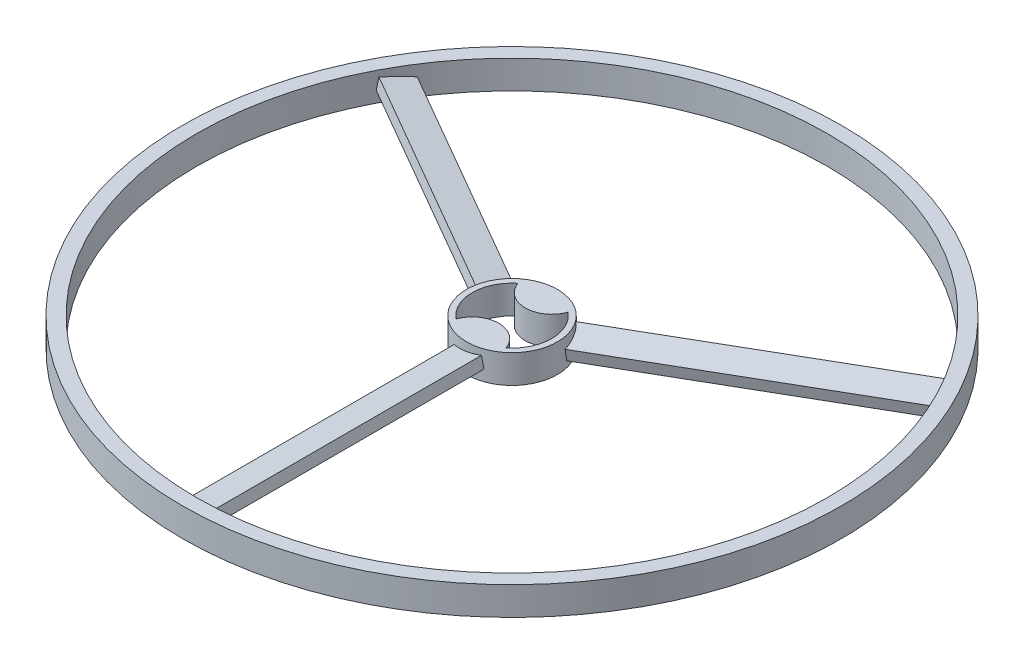
ISO-10303-21;
HEADER;
FILE_DESCRIPTION(('STEP AP214'),'2;1');
FILE_NAME('part.step','',(''),(''),'','','');
FILE_SCHEMA(('AUTOMOTIVE_DESIGN { 1 0 10303 214 1 1 1 1 }'));
ENDSEC;
DATA;
#1=APPLICATION_CONTEXT('core data for automotive mechanical design processes');
#2=APPLICATION_PROTOCOL_DEFINITION('international standard','automotive_design',2000,#1);
#3=PRODUCT_CONTEXT('',#1,'mechanical');
#4=PRODUCT('Part','Part','',(#3));
#5=PRODUCT_RELATED_PRODUCT_CATEGORY('part','',(#4));
#6=PRODUCT_DEFINITION_FORMATION('','',#4);
#7=PRODUCT_DEFINITION_CONTEXT('part definition',#1,'design');
#8=PRODUCT_DEFINITION('design','',#6,#7);
#9=PRODUCT_DEFINITION_SHAPE('','',#8);
#10=(LENGTH_UNIT() NAMED_UNIT(*) SI_UNIT(.MILLI.,.METRE.));
#11=(NAMED_UNIT(*) PLANE_ANGLE_UNIT() SI_UNIT($,.RADIAN.));
#12=(NAMED_UNIT(*) SI_UNIT($,.STERADIAN.) SOLID_ANGLE_UNIT());
#13=UNCERTAINTY_MEASURE_WITH_UNIT(LENGTH_MEASURE(1.E-05),#10,'distance_accuracy_value','');
#14=(GEOMETRIC_REPRESENTATION_CONTEXT(3) GLOBAL_UNCERTAINTY_ASSIGNED_CONTEXT((#13)) GLOBAL_UNIT_ASSIGNED_CONTEXT((#10,
#11,#12)) REPRESENTATION_CONTEXT('',''));
#15=CARTESIAN_POINT('',(0.,0.,0.));
#16=DIRECTION('',(0.,0.,1.));
#17=DIRECTION('',(1.,0.,0.));
#18=AXIS2_PLACEMENT_3D('',#15,#16,#17);
#19=CARTESIAN_POINT('',(0.,2.5,0.));
#20=DIRECTION('',(0.,-1.,0.));
#21=DIRECTION('',(0.,0.,-1.));
#22=AXIS2_PLACEMENT_3D('',#19,#20,#21);
#23=CYLINDRICAL_SURFACE('',#22,55.5);
#24=CARTESIAN_POINT('',(0.,2.5,0.));
#25=DIRECTION('',(0.,1.,0.));
#26=DIRECTION('',(0.,0.,1.));
#27=AXIS2_PLACEMENT_3D('',#24,#25,#26);
#28=CIRCLE('',#27,55.5);
#29=CARTESIAN_POINT('',(0.,2.5,55.5));
#30=VERTEX_POINT('',#29);
#31=EDGE_CURVE('E270',#30,#30,#28,.T.);
#32=ORIENTED_EDGE('',*,*,#31,.T.);
#33=EDGE_LOOP('',(#32));
#34=FACE_BOUND('',#33,.T.);
#35=CARTESIAN_POINT('',(0.,-2.5,0.));
#36=DIRECTION('',(0.,1.,0.));
#37=DIRECTION('',(0.,0.,1.));
#38=AXIS2_PLACEMENT_3D('',#35,#36,#37);
#39=CIRCLE('',#38,55.5);
#40=CARTESIAN_POINT('',(0.,-2.5,55.5));
#41=VERTEX_POINT('',#40);
#42=EDGE_CURVE('E269',#41,#41,#39,.T.);
#43=ORIENTED_EDGE('',*,*,#42,.F.);
#44=EDGE_LOOP('',(#43));
#45=FACE_BOUND('',#44,.T.);
#46=CARTESIAN_POINT('',(0.,-1.01542661188575,0.));
#47=DIRECTION('',(-0.173648177666931,0.984807753012208,0.));
#48=DIRECTION('',(-0.984807753012208,-0.173648177666931,0.));
#49=AXIS2_PLACEMENT_3D('',#46,#47,#48);
#50=ELLIPSE('',#49,56.3561769596588,55.5);
#51=CARTESIAN_POINT('',(2.63566756019745,-0.55068730884488,55.437381400208));
#52=VERTEX_POINT('',#51);
#53=CARTESIAN_POINT('',(-2.28837120486359,-1.41892819717954,55.452802969992));
#54=VERTEX_POINT('',#53);
#55=EDGE_CURVE('E266',#52,#54,#50,.F.);
#56=ORIENTED_EDGE('',*,*,#55,.F.);
#57=CARTESIAN_POINT('',(0.,14.396926207859,0.));
#58=DIRECTION('',(-0.984807753012208,-0.173648177666932,0.));
#59=DIRECTION('',(0.173648177666932,-0.984807753012208,0.));
#60=AXIS2_PLACEMENT_3D('',#57,#58,#59);
#61=ELLIPSE('',#60,319.611761814469,55.5);
#62=CARTESIAN_POINT('',(2.28837120486359,1.41892819717954,55.452802969992));
#63=VERTEX_POINT('',#62);
#64=EDGE_CURVE('E264',#63,#52,#61,.F.);
#65=ORIENTED_EDGE('',*,*,#64,.F.);
#66=CARTESIAN_POINT('',(0.,1.01542661188575,0.));
#67=DIRECTION('',(0.173648177666931,-0.984807753012208,0.));
#68=DIRECTION('',(-0.984807753012208,-0.173648177666932,0.));
#69=AXIS2_PLACEMENT_3D('',#66,#67,#68);
#70=ELLIPSE('',#69,56.3561769596589,55.5);
#71=CARTESIAN_POINT('',(-2.63566756019745,0.550687308844879,55.437381400208));
#72=VERTEX_POINT('',#71);
#73=EDGE_CURVE('E262',#72,#63,#70,.F.);
#74=ORIENTED_EDGE('',*,*,#73,.F.);
#75=CARTESIAN_POINT('',(0.,-14.396926207859,0.));
#76=DIRECTION('',(0.984807753012208,0.173648177666931,0.));
#77=DIRECTION('',(0.173648177666931,-0.984807753012208,0.));
#78=AXIS2_PLACEMENT_3D('',#75,#76,#77);
#79=ELLIPSE('',#78,319.61176181447,55.5);
#80=EDGE_CURVE('E258',#54,#72,#79,.F.);
#81=ORIENTED_EDGE('',*,*,#80,.F.);
#82=EDGE_LOOP('',(#56,#65,#74,#81));
#83=FACE_BOUND('',#82,.T.);
#84=CARTESIAN_POINT('',(0.,14.396926207859,0.));
#85=DIRECTION('',(0.492403876506108,-0.173648177666932,-0.852868531952441));
#86=DIRECTION('',(-0.0868240888334665,-0.984807753012208,0.150383733180436));
#87=AXIS2_PLACEMENT_3D('',#84,#85,#86);
#88=ELLIPSE('',#87,319.611761814469,55.5);
#89=CARTESIAN_POINT('',(-49.1677216854979,1.41892819717954,-25.7446138882956));
#90=VERTEX_POINT('',#89);
#91=CARTESIAN_POINT('',(-49.3280143919657,-0.55068730884488,-25.4361356370427));
#92=VERTEX_POINT('',#91);
#93=EDGE_CURVE('E226',#90,#92,#88,.F.);
#94=ORIENTED_EDGE('',*,*,#93,.F.);
#95=CARTESIAN_POINT('',(0.,1.01542661188575,0.));
#96=DIRECTION('',(-0.0868240888334665,-0.984807753012208,0.150383733180436));
#97=DIRECTION('',(0.492403876506108,-0.173648177666932,-0.852868531952441));
#98=AXIS2_PLACEMENT_3D('',#95,#96,#97);
#99=ELLIPSE('',#98,56.3561769596589,55.5);
#100=CARTESIAN_POINT('',(-46.6923468317682,0.550687308844879,-30.0012457631658));
#101=VERTEX_POINT('',#100);
#102=EDGE_CURVE('E231',#101,#90,#99,.F.);
#103=ORIENTED_EDGE('',*,*,#102,.F.);
#104=CARTESIAN_POINT('',(0.,-14.396926207859,0.));
#105=DIRECTION('',(-0.492403876506108,0.173648177666931,0.852868531952441));
#106=DIRECTION('',(-0.0868240888334665,-0.984807753012208,0.150383733180436));
#107=AXIS2_PLACEMENT_3D('',#104,#105,#106);
#108=ELLIPSE('',#107,319.61176181447,55.5);
#109=CARTESIAN_POINT('',(-46.8793504806343,-1.41892819717954,-29.7081890816969));
#110=VERTEX_POINT('',#109);
#111=EDGE_CURVE('E206',#110,#101,#108,.F.);
#112=ORIENTED_EDGE('',*,*,#111,.F.);
#113=CARTESIAN_POINT('',(0.,-1.01542661188575,0.));
#114=DIRECTION('',(0.0868240888334664,0.984807753012208,-0.150383733180436));
#115=DIRECTION('',(0.492403876506108,-0.173648177666931,-0.852868531952441));
#116=AXIS2_PLACEMENT_3D('',#113,#114,#115);
#117=ELLIPSE('',#116,56.3561769596588,55.5);
#118=EDGE_CURVE('E219',#92,#110,#117,.F.);
#119=ORIENTED_EDGE('',*,*,#118,.F.);
#120=EDGE_LOOP('',(#94,#103,#112,#119));
#121=FACE_BOUND('',#120,.T.);
#122=CARTESIAN_POINT('',(0.,14.396926207859,0.));
#123=DIRECTION('',(0.492403876506096,-0.173648177666932,0.852868531952447));
#124=DIRECTION('',(-0.0868240888334644,-0.984807753012208,-0.150383733180437));
#125=AXIS2_PLACEMENT_3D('',#122,#123,#124);
#126=ELLIPSE('',#125,319.611761814469,55.5);
#127=CARTESIAN_POINT('',(46.8793504806347,1.41892819717954,-29.7081890816962));
#128=VERTEX_POINT('',#127);
#129=CARTESIAN_POINT('',(46.6923468317686,-0.55068730884488,-30.0012457631651));
#130=VERTEX_POINT('',#129);
#131=EDGE_CURVE('E196',#128,#130,#126,.F.);
#132=ORIENTED_EDGE('',*,*,#131,.F.);
#133=CARTESIAN_POINT('',(0.,1.01542661188575,0.));
#134=DIRECTION('',(-0.0868240888334643,-0.984807753012208,-0.150383733180437));
#135=DIRECTION('',(0.492403876506096,-0.173648177666932,0.852868531952448));
#136=AXIS2_PLACEMENT_3D('',#133,#134,#135);
#137=ELLIPSE('',#136,56.3561769596589,55.5);
#138=CARTESIAN_POINT('',(49.328014391966,0.550687308844879,-25.436135637042));
#139=VERTEX_POINT('',#138);
#140=EDGE_CURVE('E201',#139,#128,#137,.F.);
#141=ORIENTED_EDGE('',*,*,#140,.F.);
#142=CARTESIAN_POINT('',(0.,-14.396926207859,0.));
#143=DIRECTION('',(-0.492403876506096,0.173648177666931,-0.852868531952447));
#144=DIRECTION('',(-0.0868240888334643,-0.984807753012208,-0.150383733180437));
#145=AXIS2_PLACEMENT_3D('',#142,#143,#144);
#146=ELLIPSE('',#145,319.61176181447,55.5);
#147=CARTESIAN_POINT('',(49.1677216854983,-1.41892819717954,-25.7446138882949));
#148=VERTEX_POINT('',#147);
#149=EDGE_CURVE('E176',#148,#139,#146,.F.);
#150=ORIENTED_EDGE('',*,*,#149,.F.);
#151=CARTESIAN_POINT('',(0.,-1.01542661188575,0.));
#152=DIRECTION('',(0.0868240888334643,0.984807753012208,0.150383733180437));
#153=DIRECTION('',(0.492403876506096,-0.173648177666931,0.852868531952448));
#154=AXIS2_PLACEMENT_3D('',#151,#152,#153);
#155=ELLIPSE('',#154,56.3561769596588,55.5);
#156=EDGE_CURVE('E189',#130,#148,#155,.F.);
#157=ORIENTED_EDGE('',*,*,#156,.F.);
#158=EDGE_LOOP('',(#132,#141,#150,#157));
#159=FACE_BOUND('',#158,.T.);
#160=ADVANCED_FACE('F34',(#34,#45,#83,#121,#159),#23,.F.);
#161=CARTESIAN_POINT('',(0.,2.5,0.));
#162=DIRECTION('',(0.,-1.,0.));
#163=DIRECTION('',(0.,0.,-1.));
#164=AXIS2_PLACEMENT_3D('',#161,#162,#163);
#165=CYLINDRICAL_SURFACE('',#164,8.);
#166=CARTESIAN_POINT('',(0.,1.01542661188575,0.));
#167=DIRECTION('',(-0.0868240888334665,-0.984807753012208,0.150383733180436));
#168=DIRECTION('',(0.492403876506108,-0.173648177666932,-0.852868531952441));
#169=AXIS2_PLACEMENT_3D('',#166,#167,#168);
#170=ELLIPSE('',#169,8.12341289508596,8.);
#171=CARTESIAN_POINT('',(-5.22356839253152,0.550687308844864,-6.05923536830726));
#172=VERTEX_POINT('',#171);
#173=CARTESIAN_POINT('',(-7.7828991767294,1.41892819717953,-1.85107547249291));
#174=VERTEX_POINT('',#173);
#175=EDGE_CURVE('E229',#172,#174,#170,.F.);
#176=ORIENTED_EDGE('',*,*,#175,.T.);
#177=CARTESIAN_POINT('',(0.,14.396926207859,0.));
#178=DIRECTION('',(0.492403876506108,-0.173648177666932,-0.852868531952441));
#179=DIRECTION('',(-0.0868240888334665,-0.984807753012208,0.150383733180436));
#180=AXIS2_PLACEMENT_3D('',#177,#178,#179);
#181=ELLIPSE('',#180,46.0701638651487,8.);
#182=CARTESIAN_POINT('',(-7.859235952729,-0.550687308844881,-1.49412524218419));
#183=VERTEX_POINT('',#182);
#184=EDGE_CURVE('E221',#174,#183,#181,.F.);
#185=ORIENTED_EDGE('',*,*,#184,.T.);
#186=CARTESIAN_POINT('',(0.,-1.01542661188575,0.));
#187=DIRECTION('',(0.0868240888334664,0.984807753012208,-0.150383733180436));
#188=DIRECTION('',(0.492403876506108,-0.173648177666931,-0.852868531952441));
#189=AXIS2_PLACEMENT_3D('',#186,#187,#188);
#190=ELLIPSE('',#189,8.12341289508596,8.);
#191=CARTESIAN_POINT('',(-5.4945279718658,-1.41892819717954,-5.81465066589425));
#192=VERTEX_POINT('',#191);
#193=EDGE_CURVE('E214',#183,#192,#190,.F.);
#194=ORIENTED_EDGE('',*,*,#193,.T.);
#195=CARTESIAN_POINT('',(0.,-14.396926207859,0.));
#196=DIRECTION('',(-0.492403876506108,0.173648177666931,0.852868531952441));
#197=DIRECTION('',(-0.0868240888334665,-0.984807753012208,0.150383733180436));
#198=AXIS2_PLACEMENT_3D('',#195,#196,#197);
#199=ELLIPSE('',#198,46.0701638651488,8.);
#200=EDGE_CURVE('E204',#192,#172,#199,.F.);
#201=ORIENTED_EDGE('',*,*,#200,.T.);
#202=EDGE_LOOP('',(#176,#185,#194,#201));
#203=FACE_BOUND('',#202,.T.);
#204=CARTESIAN_POINT('',(0.,2.5,0.));
#205=DIRECTION('',(0.,1.,0.));
#206=DIRECTION('',(0.,0.,1.));
#207=AXIS2_PLACEMENT_3D('',#204,#205,#206);
#208=CIRCLE('',#207,8.);
#209=CARTESIAN_POINT('',(0.,2.5,8.));
#210=VERTEX_POINT('',#209);
#211=EDGE_CURVE('E235',#210,#210,#208,.T.);
#212=ORIENTED_EDGE('',*,*,#211,.F.);
#213=EDGE_LOOP('',(#212));
#214=FACE_BOUND('',#213,.T.);
#215=CARTESIAN_POINT('',(0.,-2.5,0.));
#216=DIRECTION('',(0.,1.,0.));
#217=DIRECTION('',(0.,0.,1.));
#218=AXIS2_PLACEMENT_3D('',#215,#216,#217);
#219=CIRCLE('',#218,8.);
#220=CARTESIAN_POINT('',(0.,-2.5,8.));
#221=VERTEX_POINT('',#220);
#222=EDGE_CURVE('E234',#221,#221,#219,.T.);
#223=ORIENTED_EDGE('',*,*,#222,.T.);
#224=EDGE_LOOP('',(#223));
#225=FACE_BOUND('',#224,.T.);
#226=CARTESIAN_POINT('',(0.,1.01542661188575,0.));
#227=DIRECTION('',(0.173648177666931,-0.984807753012208,0.));
#228=DIRECTION('',(-0.984807753012208,-0.173648177666932,0.));
#229=AXIS2_PLACEMENT_3D('',#226,#227,#228);
#230=ELLIPSE('',#229,8.12341289508596,8.);
#231=CARTESIAN_POINT('',(-2.63566756019745,0.550687308844879,7.5533606104914));
#232=VERTEX_POINT('',#231);
#233=CARTESIAN_POINT('',(2.28837120486359,1.41892819717954,7.66572613838711));
#234=VERTEX_POINT('',#233);
#235=EDGE_CURVE('E243',#232,#234,#230,.F.);
#236=ORIENTED_EDGE('',*,*,#235,.T.);
#237=CARTESIAN_POINT('',(0.,14.396926207859,0.));
#238=DIRECTION('',(-0.984807753012208,-0.173648177666932,0.));
#239=DIRECTION('',(0.173648177666932,-0.984807753012208,0.));
#240=AXIS2_PLACEMENT_3D('',#237,#238,#239);
#241=ELLIPSE('',#240,46.0701638651487,8.);
#242=CARTESIAN_POINT('',(2.63566756019745,-0.55068730884488,7.5533606104914));
#243=VERTEX_POINT('',#242);
#244=EDGE_CURVE('E246',#234,#243,#241,.F.);
#245=ORIENTED_EDGE('',*,*,#244,.T.);
#246=CARTESIAN_POINT('',(0.,-1.01542661188575,0.));
#247=DIRECTION('',(-0.173648177666931,0.984807753012208,0.));
#248=DIRECTION('',(-0.984807753012208,-0.173648177666931,0.));
#249=AXIS2_PLACEMENT_3D('',#246,#247,#248);
#250=ELLIPSE('',#249,8.12341289508596,8.);
#251=CARTESIAN_POINT('',(-2.28837120486359,-1.41892819717954,7.66572613838711));
#252=VERTEX_POINT('',#251);
#253=EDGE_CURVE('E238',#243,#252,#250,.F.);
#254=ORIENTED_EDGE('',*,*,#253,.T.);
#255=CARTESIAN_POINT('',(0.,-14.396926207859,0.));
#256=DIRECTION('',(0.984807753012208,0.173648177666931,0.));
#257=DIRECTION('',(0.173648177666931,-0.984807753012208,0.));
#258=AXIS2_PLACEMENT_3D('',#255,#256,#257);
#259=ELLIPSE('',#258,46.0701638651488,8.);
#260=EDGE_CURVE('E279',#252,#232,#259,.F.);
#261=ORIENTED_EDGE('',*,*,#260,.T.);
#262=EDGE_LOOP('',(#236,#245,#254,#261));
#263=FACE_BOUND('',#262,.T.);
#264=CARTESIAN_POINT('',(0.,1.01542661188575,0.));
#265=DIRECTION('',(-0.0868240888334643,-0.984807753012208,-0.150383733180437));
#266=DIRECTION('',(0.492403876506096,-0.173648177666932,0.852868531952448));
#267=AXIS2_PLACEMENT_3D('',#264,#265,#266);
#268=ELLIPSE('',#267,8.12341289508596,8.);
#269=CARTESIAN_POINT('',(7.85923595272902,0.550687308844904,-1.49412524218407));
#270=VERTEX_POINT('',#269);
#271=CARTESIAN_POINT('',(5.49452797186587,1.41892819717954,-5.81465066589417));
#272=VERTEX_POINT('',#271);
#273=EDGE_CURVE('E199',#270,#272,#268,.F.);
#274=ORIENTED_EDGE('',*,*,#273,.T.);
#275=CARTESIAN_POINT('',(0.,14.396926207859,0.));
#276=DIRECTION('',(0.492403876506096,-0.173648177666932,0.852868531952447));
#277=DIRECTION('',(-0.0868240888334644,-0.984807753012208,-0.150383733180437));
#278=AXIS2_PLACEMENT_3D('',#275,#276,#277);
#279=ELLIPSE('',#278,46.0701638651487,8.);
#280=CARTESIAN_POINT('',(5.22356839253161,-0.550687308844881,-6.05923536830719));
#281=VERTEX_POINT('',#280);
#282=EDGE_CURVE('E191',#272,#281,#279,.F.);
#283=ORIENTED_EDGE('',*,*,#282,.T.);
#284=CARTESIAN_POINT('',(0.,-1.01542661188575,0.));
#285=DIRECTION('',(0.0868240888334643,0.984807753012208,0.150383733180437));
#286=DIRECTION('',(0.492403876506096,-0.173648177666931,0.852868531952448));
#287=AXIS2_PLACEMENT_3D('',#284,#285,#286);
#288=ELLIPSE('',#287,8.12341289508596,8.);
#289=CARTESIAN_POINT('',(7.78289917672944,-1.41892819717954,-1.85107547249281));
#290=VERTEX_POINT('',#289);
#291=EDGE_CURVE('E184',#281,#290,#288,.F.);
#292=ORIENTED_EDGE('',*,*,#291,.T.);
#293=CARTESIAN_POINT('',(0.,-14.396926207859,0.));
#294=DIRECTION('',(-0.492403876506096,0.173648177666931,-0.852868531952447));
#295=DIRECTION('',(-0.0868240888334643,-0.984807753012208,-0.150383733180437));
#296=AXIS2_PLACEMENT_3D('',#293,#294,#295);
#297=ELLIPSE('',#296,46.0701638651488,8.);
#298=EDGE_CURVE('E172',#290,#270,#297,.F.);
#299=ORIENTED_EDGE('',*,*,#298,.T.);
#300=EDGE_LOOP('',(#274,#283,#292,#299));
#301=FACE_BOUND('',#300,.T.);
#302=ADVANCED_FACE('F308',(#203,#214,#225,#263,#301),#165,.T.);
#303=CARTESIAN_POINT('',(0.,2.5,0.));
#304=DIRECTION('',(0.,1.,0.));
#305=DIRECTION('',(0.,0.,1.));
#306=AXIS2_PLACEMENT_3D('',#303,#304,#305);
#307=PLANE('',#306);
#308=CARTESIAN_POINT('',(0.,2.5,0.));
#309=DIRECTION('',(0.,1.,0.));
#310=DIRECTION('',(0.,0.,1.));
#311=AXIS2_PLACEMENT_3D('',#308,#309,#310);
#312=CIRCLE('',#311,58.);
#313=CARTESIAN_POINT('',(0.,2.5,58.));
#314=VERTEX_POINT('',#313);
#315=EDGE_CURVE('E276',#314,#314,#312,.T.);
#316=ORIENTED_EDGE('',*,*,#315,.T.);
#317=EDGE_LOOP('',(#316));
#318=FACE_BOUND('',#317,.T.);
#319=ORIENTED_EDGE('',*,*,#31,.F.);
#320=EDGE_LOOP('',(#319));
#321=FACE_BOUND('',#320,.T.);
#322=ADVANCED_FACE('F314',(#318,#321),#307,.T.);
#323=CARTESIAN_POINT('',(0.,-2.5,0.));
#324=DIRECTION('',(0.,1.,0.));
#325=DIRECTION('',(0.,0.,1.));
#326=AXIS2_PLACEMENT_3D('',#323,#324,#325);
#327=PLANE('',#326);
#328=CARTESIAN_POINT('',(0.,-2.5,0.));
#329=DIRECTION('',(0.,1.,0.));
#330=DIRECTION('',(0.,0.,1.));
#331=AXIS2_PLACEMENT_3D('',#328,#329,#330);
#332=CIRCLE('',#331,58.);
#333=CARTESIAN_POINT('',(0.,-2.5,58.));
#334=VERTEX_POINT('',#333);
#335=EDGE_CURVE('E273',#334,#334,#332,.T.);
#336=ORIENTED_EDGE('',*,*,#335,.F.);
#337=EDGE_LOOP('',(#336));
#338=FACE_BOUND('',#337,.T.);
#339=ORIENTED_EDGE('',*,*,#42,.T.);
#340=EDGE_LOOP('',(#339));
#341=FACE_BOUND('',#340,.T.);
#342=ADVANCED_FACE('F323',(#338,#341),#327,.F.);
#343=CARTESIAN_POINT('',(0.,2.5,0.));
#344=DIRECTION('',(0.,-1.,0.));
#345=DIRECTION('',(0.,0.,-1.));
#346=AXIS2_PLACEMENT_3D('',#343,#344,#345);
#347=CYLINDRICAL_SURFACE('',#346,58.);
#348=ORIENTED_EDGE('',*,*,#315,.F.);
#349=EDGE_LOOP('',(#348));
#350=FACE_BOUND('',#349,.T.);
#351=ORIENTED_EDGE('',*,*,#335,.T.);
#352=EDGE_LOOP('',(#351));
#353=FACE_BOUND('',#352,.T.);
#354=ADVANCED_FACE('F36',(#350,#353),#347,.T.);
#355=CARTESIAN_POINT('',(2.28837120486359,1.41892819717954,58.002));
#356=DIRECTION('',(-0.984807753012208,-0.173648177666932,0.));
#357=DIRECTION('',(0.173648177666932,-0.984807753012208,0.));
#358=AXIS2_PLACEMENT_3D('',#355,#356,#357);
#359=PLANE('',#358);
#360=ORIENTED_EDGE('',*,*,#244,.F.);
#361=DIRECTION('',(0.,0.,-1.));
#362=VECTOR('',#361,1.);
#363=CARTESIAN_POINT('',(2.28837120486359,1.41892819717954,58.002));
#364=LINE('',#363,#362);
#365=EDGE_CURVE('E254',#63,#234,#364,.T.);
#366=ORIENTED_EDGE('',*,*,#365,.F.);
#367=ORIENTED_EDGE('',*,*,#64,.T.);
#368=DIRECTION('',(0.,0.,-1.));
#369=VECTOR('',#368,1.);
#370=CARTESIAN_POINT('',(2.63566756019745,-0.55068730884488,58.002));
#371=LINE('',#370,#369);
#372=EDGE_CURVE('E255',#52,#243,#371,.T.);
#373=ORIENTED_EDGE('',*,*,#372,.T.);
#374=EDGE_LOOP('',(#360,#366,#367,#373));
#375=FACE_BOUND('',#374,.T.);
#376=ADVANCED_FACE('F330',(#375),#359,.F.);
#377=CARTESIAN_POINT('',(-2.63566756019745,0.550687308844879,58.002));
#378=DIRECTION('',(0.173648177666931,-0.984807753012208,0.));
#379=DIRECTION('',(0.984807753012208,0.173648177666932,0.));
#380=AXIS2_PLACEMENT_3D('',#377,#378,#379);
#381=PLANE('',#380);
#382=ORIENTED_EDGE('',*,*,#235,.F.);
#383=DIRECTION('',(0.,0.,-1.));
#384=VECTOR('',#383,1.);
#385=CARTESIAN_POINT('',(-2.63566756019745,0.550687308844879,58.002));
#386=LINE('',#385,#384);
#387=EDGE_CURVE('E252',#72,#232,#386,.T.);
#388=ORIENTED_EDGE('',*,*,#387,.F.);
#389=ORIENTED_EDGE('',*,*,#73,.T.);
#390=ORIENTED_EDGE('',*,*,#365,.T.);
#391=EDGE_LOOP('',(#382,#388,#389,#390));
#392=FACE_BOUND('',#391,.T.);
#393=ADVANCED_FACE('F392',(#392),#381,.F.);
#394=CARTESIAN_POINT('',(2.63566756019745,-0.55068730884488,58.002));
#395=DIRECTION('',(-0.173648177666931,0.984807753012208,0.));
#396=DIRECTION('',(-0.984807753012208,-0.173648177666931,0.));
#397=AXIS2_PLACEMENT_3D('',#394,#395,#396);
#398=PLANE('',#397);
#399=ORIENTED_EDGE('',*,*,#253,.F.);
#400=ORIENTED_EDGE('',*,*,#372,.F.);
#401=ORIENTED_EDGE('',*,*,#55,.T.);
#402=DIRECTION('',(0.,0.,-1.));
#403=VECTOR('',#402,1.);
#404=CARTESIAN_POINT('',(-2.28837120486359,-1.41892819717954,58.002));
#405=LINE('',#404,#403);
#406=EDGE_CURVE('E249',#54,#252,#405,.T.);
#407=ORIENTED_EDGE('',*,*,#406,.T.);
#408=EDGE_LOOP('',(#399,#400,#401,#407));
#409=FACE_BOUND('',#408,.T.);
#410=ADVANCED_FACE('F320',(#409),#398,.F.);
#411=CARTESIAN_POINT('',(-2.28837120486359,-1.41892819717954,58.002));
#412=DIRECTION('',(0.984807753012208,0.173648177666931,0.));
#413=DIRECTION('',(-0.173648177666931,0.984807753012208,0.));
#414=AXIS2_PLACEMENT_3D('',#411,#412,#413);
#415=PLANE('',#414);
#416=ORIENTED_EDGE('',*,*,#260,.F.);
#417=ORIENTED_EDGE('',*,*,#406,.F.);
#418=ORIENTED_EDGE('',*,*,#80,.T.);
#419=ORIENTED_EDGE('',*,*,#387,.T.);
#420=EDGE_LOOP('',(#416,#417,#418,#419));
#421=FACE_BOUND('',#420,.T.);
#422=ADVANCED_FACE('F332',(#421),#415,.F.);
#423=CARTESIAN_POINT('',(0.,2.5,0.));
#424=DIRECTION('',(0.,1.,0.));
#425=DIRECTION('',(0.,0.,1.));
#426=AXIS2_PLACEMENT_3D('',#423,#424,#425);
#427=PLANE('',#426);
#428=CARTESIAN_POINT('',(0.,2.5,7.));
#429=DIRECTION('',(0.,1.,0.));
#430=DIRECTION('',(0.,0.,1.));
#431=AXIS2_PLACEMENT_3D('',#428,#429,#430);
#432=CIRCLE('',#431,4.6667);
#433=CARTESIAN_POINT('',(-4.39980302593617,2.5,5.44442222214286));
#434=VERTEX_POINT('',#433);
#435=CARTESIAN_POINT('',(4.39980302593616,2.5,5.44442222214286));
#436=VERTEX_POINT('',#435);
#437=EDGE_CURVE('E158',#434,#436,#432,.F.);
#438=ORIENTED_EDGE('',*,*,#437,.F.);
#439=CARTESIAN_POINT('',(0.,2.5,0.));
#440=DIRECTION('',(0.,1.,0.));
#441=DIRECTION('',(0.,0.,1.));
#442=AXIS2_PLACEMENT_3D('',#439,#440,#441);
#443=CIRCLE('',#442,7.);
#444=CARTESIAN_POINT('',(-4.39980302593617,2.5,-5.44442222214286));
#445=VERTEX_POINT('',#444);
#446=EDGE_CURVE('E49',#434,#445,#443,.F.);
#447=ORIENTED_EDGE('',*,*,#446,.T.);
#448=CARTESIAN_POINT('',(0.,2.5,-7.));
#449=DIRECTION('',(0.,1.,0.));
#450=DIRECTION('',(0.,0.,1.));
#451=AXIS2_PLACEMENT_3D('',#448,#449,#450);
#452=CIRCLE('',#451,4.6667);
#453=CARTESIAN_POINT('',(4.39980302593616,2.5,-5.44442222214286));
#454=VERTEX_POINT('',#453);
#455=EDGE_CURVE('E165',#445,#454,#452,.T.);
#456=ORIENTED_EDGE('',*,*,#455,.T.);
#457=CARTESIAN_POINT('',(0.,2.5,0.));
#458=DIRECTION('',(0.,1.,0.));
#459=DIRECTION('',(0.,0.,1.));
#460=AXIS2_PLACEMENT_3D('',#457,#458,#459);
#461=CIRCLE('',#460,7.);
#462=EDGE_CURVE('E149',#436,#454,#461,.T.);
#463=ORIENTED_EDGE('',*,*,#462,.F.);
#464=EDGE_LOOP('',(#438,#447,#456,#463));
#465=FACE_BOUND('',#464,.T.);
#466=ORIENTED_EDGE('',*,*,#211,.T.);
#467=EDGE_LOOP('',(#466));
#468=FACE_BOUND('',#467,.T.);
#469=ADVANCED_FACE('F162',(#465,#468),#427,.T.);
#470=CARTESIAN_POINT('',(0.,-2.5,0.));
#471=DIRECTION('',(0.,1.,0.));
#472=DIRECTION('',(0.,0.,1.));
#473=AXIS2_PLACEMENT_3D('',#470,#471,#472);
#474=PLANE('',#473);
#475=CARTESIAN_POINT('',(0.,-2.5,0.));
#476=DIRECTION('',(0.,1.,0.));
#477=DIRECTION('',(0.,0.,1.));
#478=AXIS2_PLACEMENT_3D('',#475,#476,#477);
#479=CIRCLE('',#478,7.);
#480=CARTESIAN_POINT('',(-4.39980302593617,-2.5,5.44442222214286));
#481=VERTEX_POINT('',#480);
#482=CARTESIAN_POINT('',(-4.39980302593617,-2.5,-5.44442222214286));
#483=VERTEX_POINT('',#482);
#484=EDGE_CURVE('E11',#481,#483,#479,.F.);
#485=ORIENTED_EDGE('',*,*,#484,.F.);
#486=CARTESIAN_POINT('',(0.,-2.5,7.));
#487=DIRECTION('',(0.,1.,0.));
#488=DIRECTION('',(0.,0.,1.));
#489=AXIS2_PLACEMENT_3D('',#486,#487,#488);
#490=CIRCLE('',#489,4.6667);
#491=CARTESIAN_POINT('',(4.39980302593617,-2.5,5.44442222214286));
#492=VERTEX_POINT('',#491);
#493=EDGE_CURVE('E284',#481,#492,#490,.F.);
#494=ORIENTED_EDGE('',*,*,#493,.T.);
#495=CARTESIAN_POINT('',(0.,-2.5,0.));
#496=DIRECTION('',(0.,1.,0.));
#497=DIRECTION('',(0.,0.,1.));
#498=AXIS2_PLACEMENT_3D('',#495,#496,#497);
#499=CIRCLE('',#498,7.);
#500=CARTESIAN_POINT('',(4.39980302593616,-2.5,-5.44442222214286));
#501=VERTEX_POINT('',#500);
#502=EDGE_CURVE('E152',#492,#501,#499,.T.);
#503=ORIENTED_EDGE('',*,*,#502,.T.);
#504=CARTESIAN_POINT('',(0.,-2.5,-7.));
#505=DIRECTION('',(0.,1.,0.));
#506=DIRECTION('',(0.,0.,1.));
#507=AXIS2_PLACEMENT_3D('',#504,#505,#506);
#508=CIRCLE('',#507,4.6667);
#509=EDGE_CURVE('E42',#483,#501,#508,.T.);
#510=ORIENTED_EDGE('',*,*,#509,.F.);
#511=EDGE_LOOP('',(#485,#494,#503,#510));
#512=FACE_BOUND('',#511,.T.);
#513=ORIENTED_EDGE('',*,*,#222,.F.);
#514=EDGE_LOOP('',(#513));
#515=FACE_BOUND('',#514,.T.);
#516=ADVANCED_FACE('F292',(#512,#515),#474,.F.);
#517=CARTESIAN_POINT('',(-48.9133716902062,0.550687308844879,-31.2835550630618));
#518=DIRECTION('',(-0.0868240888334665,-0.984807753012208,0.150383733180436));
#519=DIRECTION('',(-0.492403876506108,0.173648177666932,0.852868531952441));
#520=AXIS2_PLACEMENT_3D('',#517,#518,#519);
#521=PLANE('',#520);
#522=ORIENTED_EDGE('',*,*,#175,.F.);
#523=DIRECTION('',(0.866025403784436,0.,0.500000000000004));
#524=VECTOR('',#523,1.);
#525=CARTESIAN_POINT('',(-48.9133716902062,0.550687308844879,-31.2835550630618));
#526=LINE('',#525,#524);
#527=EDGE_CURVE('E211',#101,#172,#526,.T.);
#528=ORIENTED_EDGE('',*,*,#527,.F.);
#529=ORIENTED_EDGE('',*,*,#102,.T.);
#530=DIRECTION('',(0.866025403784436,0.,0.500000000000004));
#531=VECTOR('',#530,1.);
#532=CARTESIAN_POINT('',(-51.3753910727367,1.41892819717954,-27.0192124032996));
#533=LINE('',#532,#531);
#534=EDGE_CURVE('E223',#90,#174,#533,.T.);
#535=ORIENTED_EDGE('',*,*,#534,.T.);
#536=EDGE_LOOP('',(#522,#528,#529,#535));
#537=FACE_BOUND('',#536,.T.);
#538=ADVANCED_FACE('F381',(#537),#521,.F.);
#539=CARTESIAN_POINT('',(-51.3753910727367,1.41892819717954,-27.0192124032996));
#540=DIRECTION('',(0.492403876506108,-0.173648177666932,-0.852868531952441));
#541=DIRECTION('',(-0.0868240888334665,-0.984807753012208,0.150383733180436));
#542=AXIS2_PLACEMENT_3D('',#539,#540,#541);
#543=PLANE('',#542);
#544=ORIENTED_EDGE('',*,*,#184,.F.);
#545=ORIENTED_EDGE('',*,*,#534,.F.);
#546=ORIENTED_EDGE('',*,*,#93,.T.);
#547=DIRECTION('',(0.866025403784436,0.,0.500000000000004));
#548=VECTOR('',#547,1.);
#549=CARTESIAN_POINT('',(-51.5490392504036,-0.55068730884488,-26.7184449369387));
#550=LINE('',#549,#548);
#551=EDGE_CURVE('E216',#92,#183,#550,.T.);
#552=ORIENTED_EDGE('',*,*,#551,.T.);
#553=EDGE_LOOP('',(#544,#545,#546,#552));
#554=FACE_BOUND('',#553,.T.);
#555=ADVANCED_FACE('F377',(#554),#543,.F.);
#556=CARTESIAN_POINT('',(-51.5490392504036,-0.55068730884488,-26.7184449369387));
#557=DIRECTION('',(0.0868240888334664,0.984807753012208,-0.150383733180436));
#558=DIRECTION('',(0.492403876506108,-0.173648177666931,-0.852868531952441));
#559=AXIS2_PLACEMENT_3D('',#556,#557,#558);
#560=PLANE('',#559);
#561=ORIENTED_EDGE('',*,*,#193,.F.);
#562=ORIENTED_EDGE('',*,*,#551,.F.);
#563=ORIENTED_EDGE('',*,*,#118,.T.);
#564=DIRECTION('',(0.866025403784436,0.,0.500000000000004));
#565=VECTOR('',#564,1.);
#566=CARTESIAN_POINT('',(-49.0870198678731,-1.41892819717954,-30.9827875967009));
#567=LINE('',#566,#565);
#568=EDGE_CURVE('E208',#110,#192,#567,.T.);
#569=ORIENTED_EDGE('',*,*,#568,.T.);
#570=EDGE_LOOP('',(#561,#562,#563,#569));
#571=FACE_BOUND('',#570,.T.);
#572=ADVANCED_FACE('F373',(#571),#560,.F.);
#573=CARTESIAN_POINT('',(-49.0870198678731,-1.41892819717954,-30.9827875967009));
#574=DIRECTION('',(-0.492403876506108,0.173648177666931,0.852868531952441));
#575=DIRECTION('',(0.0868240888334665,0.984807753012208,-0.150383733180436));
#576=AXIS2_PLACEMENT_3D('',#573,#574,#575);
#577=PLANE('',#576);
#578=ORIENTED_EDGE('',*,*,#200,.F.);
#579=ORIENTED_EDGE('',*,*,#568,.F.);
#580=ORIENTED_EDGE('',*,*,#111,.T.);
#581=ORIENTED_EDGE('',*,*,#527,.T.);
#582=EDGE_LOOP('',(#578,#579,#580,#581));
#583=FACE_BOUND('',#582,.T.);
#584=ADVANCED_FACE('F370',(#583),#577,.F.);
#585=CARTESIAN_POINT('',(51.549039250404,0.550687308844879,-26.718444936938));
#586=DIRECTION('',(-0.0868240888334643,-0.984807753012208,-0.150383733180437));
#587=DIRECTION('',(-0.492403876506096,0.173648177666932,-0.852868531952448));
#588=AXIS2_PLACEMENT_3D('',#585,#586,#587);
#589=PLANE('',#588);
#590=ORIENTED_EDGE('',*,*,#273,.F.);
#591=DIRECTION('',(-0.866025403784443,0.,0.499999999999992));
#592=VECTOR('',#591,1.);
#593=CARTESIAN_POINT('',(51.549039250404,0.550687308844879,-26.718444936938));
#594=LINE('',#593,#592);
#595=EDGE_CURVE('E181',#139,#270,#594,.T.);
#596=ORIENTED_EDGE('',*,*,#595,.F.);
#597=ORIENTED_EDGE('',*,*,#140,.T.);
#598=DIRECTION('',(-0.866025403784443,0.,0.499999999999992));
#599=VECTOR('',#598,1.);
#600=CARTESIAN_POINT('',(49.0870198678735,1.41892819717954,-30.9827875967002));
#601=LINE('',#600,#599);
#602=EDGE_CURVE('E193',#128,#272,#601,.T.);
#603=ORIENTED_EDGE('',*,*,#602,.T.);
#604=EDGE_LOOP('',(#590,#596,#597,#603));
#605=FACE_BOUND('',#604,.T.);
#606=ADVANCED_FACE('F355',(#605),#589,.F.);
#607=CARTESIAN_POINT('',(49.0870198678735,1.41892819717954,-30.9827875967002));
#608=DIRECTION('',(0.492403876506096,-0.173648177666932,0.852868531952447));
#609=DIRECTION('',(-0.0868240888334644,-0.984807753012208,-0.150383733180437));
#610=AXIS2_PLACEMENT_3D('',#607,#608,#609);
#611=PLANE('',#610);
#612=ORIENTED_EDGE('',*,*,#282,.F.);
#613=ORIENTED_EDGE('',*,*,#602,.F.);
#614=ORIENTED_EDGE('',*,*,#131,.T.);
#615=DIRECTION('',(-0.866025403784443,0.,0.499999999999992));
#616=VECTOR('',#615,1.);
#617=CARTESIAN_POINT('',(48.9133716902066,-0.55068730884488,-31.2835550630611));
#618=LINE('',#617,#616);
#619=EDGE_CURVE('E186',#130,#281,#618,.T.);
#620=ORIENTED_EDGE('',*,*,#619,.T.);
#621=EDGE_LOOP('',(#612,#613,#614,#620));
#622=FACE_BOUND('',#621,.T.);
#623=ADVANCED_FACE('F351',(#622),#611,.F.);
#624=CARTESIAN_POINT('',(48.9133716902066,-0.55068730884488,-31.2835550630611));
#625=DIRECTION('',(0.0868240888334643,0.984807753012208,0.150383733180437));
#626=DIRECTION('',(0.492403876506096,-0.173648177666931,0.852868531952448));
#627=AXIS2_PLACEMENT_3D('',#624,#625,#626);
#628=PLANE('',#627);
#629=ORIENTED_EDGE('',*,*,#291,.F.);
#630=ORIENTED_EDGE('',*,*,#619,.F.);
#631=ORIENTED_EDGE('',*,*,#156,.T.);
#632=DIRECTION('',(-0.866025403784443,0.,0.499999999999992));
#633=VECTOR('',#632,1.);
#634=CARTESIAN_POINT('',(51.3753910727371,-1.41892819717954,-27.0192124032989));
#635=LINE('',#634,#633);
#636=EDGE_CURVE('E178',#148,#290,#635,.T.);
#637=ORIENTED_EDGE('',*,*,#636,.T.);
#638=EDGE_LOOP('',(#629,#630,#631,#637));
#639=FACE_BOUND('',#638,.T.);
#640=ADVANCED_FACE('F303',(#639),#628,.F.);
#641=CARTESIAN_POINT('',(51.3753910727371,-1.41892819717954,-27.0192124032989));
#642=DIRECTION('',(-0.492403876506096,0.173648177666931,-0.852868531952447));
#643=DIRECTION('',(0.0868240888334643,0.984807753012208,0.150383733180437));
#644=AXIS2_PLACEMENT_3D('',#641,#642,#643);
#645=PLANE('',#644);
#646=ORIENTED_EDGE('',*,*,#298,.F.);
#647=ORIENTED_EDGE('',*,*,#636,.F.);
#648=ORIENTED_EDGE('',*,*,#149,.T.);
#649=ORIENTED_EDGE('',*,*,#595,.T.);
#650=EDGE_LOOP('',(#646,#647,#648,#649));
#651=FACE_BOUND('',#650,.T.);
#652=ADVANCED_FACE('F296',(#651),#645,.F.);
#653=CARTESIAN_POINT('',(0.,-7.5,0.));
#654=DIRECTION('',(0.,1.,0.));
#655=DIRECTION('',(0.,0.,1.));
#656=AXIS2_PLACEMENT_3D('',#653,#654,#655);
#657=CYLINDRICAL_SURFACE('',#656,7.);
#658=ORIENTED_EDGE('',*,*,#484,.T.);
#659=DIRECTION('',(0.,1.,0.));
#660=VECTOR('',#659,1.);
#661=CARTESIAN_POINT('',(-4.39980302593617,-7.5,-5.44442222214286));
#662=LINE('',#661,#660);
#663=EDGE_CURVE('E170',#483,#445,#662,.T.);
#664=ORIENTED_EDGE('',*,*,#663,.T.);
#665=ORIENTED_EDGE('',*,*,#446,.F.);
#666=DIRECTION('',(0.,1.,0.));
#667=VECTOR('',#666,1.);
#668=CARTESIAN_POINT('',(-4.39980302593617,-7.5,5.44442222214286));
#669=LINE('',#668,#667);
#670=EDGE_CURVE('E155',#481,#434,#669,.T.);
#671=ORIENTED_EDGE('',*,*,#670,.F.);
#672=EDGE_LOOP('',(#658,#664,#665,#671));
#673=FACE_BOUND('',#672,.T.);
#674=ADVANCED_FACE('F294',(#673),#657,.F.);
#675=CARTESIAN_POINT('',(0.,-7.5,-7.));
#676=DIRECTION('',(0.,1.,0.));
#677=DIRECTION('',(0.,0.,1.));
#678=AXIS2_PLACEMENT_3D('',#675,#676,#677);
#679=CYLINDRICAL_SURFACE('',#678,4.6667);
#680=ORIENTED_EDGE('',*,*,#509,.T.);
#681=DIRECTION('',(0.,1.,0.));
#682=VECTOR('',#681,1.);
#683=CARTESIAN_POINT('',(4.39980302593616,-7.5,-5.44442222214286));
#684=LINE('',#683,#682);
#685=EDGE_CURVE('E154',#501,#454,#684,.T.);
#686=ORIENTED_EDGE('',*,*,#685,.T.);
#687=ORIENTED_EDGE('',*,*,#455,.F.);
#688=ORIENTED_EDGE('',*,*,#663,.F.);
#689=EDGE_LOOP('',(#680,#686,#687,#688));
#690=FACE_BOUND('',#689,.T.);
#691=ADVANCED_FACE('F289',(#690),#679,.T.);
#692=CARTESIAN_POINT('',(0.,-7.5,0.));
#693=DIRECTION('',(0.,1.,0.));
#694=DIRECTION('',(0.,0.,1.));
#695=AXIS2_PLACEMENT_3D('',#692,#693,#694);
#696=CYLINDRICAL_SURFACE('',#695,7.);
#697=DIRECTION('',(0.,1.,0.));
#698=VECTOR('',#697,1.);
#699=CARTESIAN_POINT('',(4.39980302593616,-7.5,5.44442222214286));
#700=LINE('',#699,#698);
#701=EDGE_CURVE('E57',#492,#436,#700,.T.);
#702=ORIENTED_EDGE('',*,*,#701,.T.);
#703=ORIENTED_EDGE('',*,*,#462,.T.);
#704=ORIENTED_EDGE('',*,*,#685,.F.);
#705=ORIENTED_EDGE('',*,*,#502,.F.);
#706=EDGE_LOOP('',(#702,#703,#704,#705));
#707=FACE_BOUND('',#706,.T.);
#708=ADVANCED_FACE('F146',(#707),#696,.F.);
#709=CARTESIAN_POINT('',(0.,-7.5,7.));
#710=DIRECTION('',(0.,1.,0.));
#711=DIRECTION('',(0.,0.,1.));
#712=AXIS2_PLACEMENT_3D('',#709,#710,#711);
#713=CYLINDRICAL_SURFACE('',#712,4.6667);
#714=ORIENTED_EDGE('',*,*,#670,.T.);
#715=ORIENTED_EDGE('',*,*,#437,.T.);
#716=ORIENTED_EDGE('',*,*,#701,.F.);
#717=ORIENTED_EDGE('',*,*,#493,.F.);
#718=EDGE_LOOP('',(#714,#715,#716,#717));
#719=FACE_BOUND('',#718,.T.);
#720=ADVANCED_FACE('F159',(#719),#713,.T.);
#721=CLOSED_SHELL('',(#160,#302,#322,#342,#354,#376,#393,#410,#422,#469,#516,#538,#555,#572,
#584,#606,#623,#640,#652,#674,#691,#708,#720));
#722=MANIFOLD_SOLID_BREP('B2',#721);
#723=ADVANCED_BREP_SHAPE_REPRESENTATION('',(#18,#722),#14);
#724=SHAPE_DEFINITION_REPRESENTATION(#9,#723);
ENDSEC;
END-ISO-10303-21;
